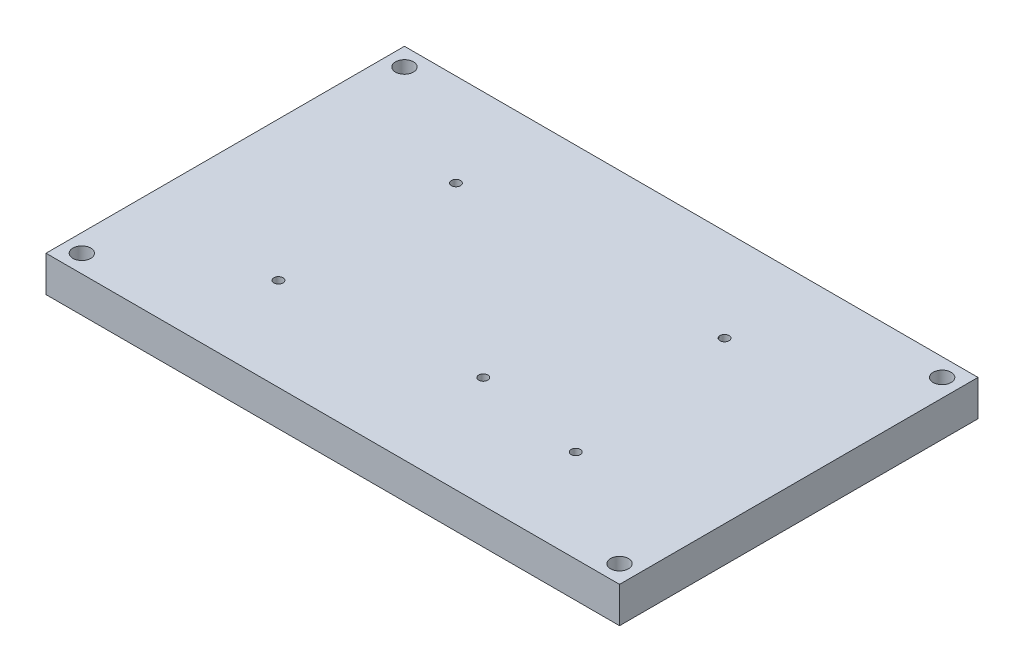
ISO-10303-21;
HEADER;
FILE_DESCRIPTION(('STEP AP214'),'2;1');
FILE_NAME('part.step','',(''),(''),'','','');
FILE_SCHEMA(('AUTOMOTIVE_DESIGN { 1 0 10303 214 1 1 1 1 }'));
ENDSEC;
DATA;
#1=APPLICATION_CONTEXT('core data for automotive mechanical design processes');
#2=APPLICATION_PROTOCOL_DEFINITION('international standard','automotive_design',2000,#1);
#3=PRODUCT_CONTEXT('',#1,'mechanical');
#4=PRODUCT('Part','Part','',(#3));
#5=PRODUCT_RELATED_PRODUCT_CATEGORY('part','',(#4));
#6=PRODUCT_DEFINITION_FORMATION('','',#4);
#7=PRODUCT_DEFINITION_CONTEXT('part definition',#1,'design');
#8=PRODUCT_DEFINITION('design','',#6,#7);
#9=PRODUCT_DEFINITION_SHAPE('','',#8);
#10=(LENGTH_UNIT() NAMED_UNIT(*) SI_UNIT(.MILLI.,.METRE.));
#11=(NAMED_UNIT(*) PLANE_ANGLE_UNIT() SI_UNIT($,.RADIAN.));
#12=(NAMED_UNIT(*) SI_UNIT($,.STERADIAN.) SOLID_ANGLE_UNIT());
#13=UNCERTAINTY_MEASURE_WITH_UNIT(LENGTH_MEASURE(1.E-05),#10,'distance_accuracy_value','');
#14=(GEOMETRIC_REPRESENTATION_CONTEXT(3) GLOBAL_UNCERTAINTY_ASSIGNED_CONTEXT((#13)) GLOBAL_UNIT_ASSIGNED_CONTEXT((#10,
#11,#12)) REPRESENTATION_CONTEXT('',''));
#15=CARTESIAN_POINT('',(0.,0.,0.));
#16=DIRECTION('',(0.,0.,1.));
#17=DIRECTION('',(1.,0.,0.));
#18=AXIS2_PLACEMENT_3D('',#15,#16,#17);
#19=CARTESIAN_POINT('',(0.,10.,0.));
#20=DIRECTION('',(0.,-1.,0.));
#21=DIRECTION('',(0.,0.,-1.));
#22=AXIS2_PLACEMENT_3D('',#19,#20,#21);
#23=PLANE('',#22);
#24=CARTESIAN_POINT('',(40.24,10.,-74.13));
#25=DIRECTION('',(0.,1.,0.));
#26=DIRECTION('',(0.,0.,1.));
#27=AXIS2_PLACEMENT_3D('',#24,#25,#26);
#28=CIRCLE('',#27,1.26999999999999);
#29=CARTESIAN_POINT('',(40.24,10.,-72.86));
#30=VERTEX_POINT('',#29);
#31=EDGE_CURVE('E147',#30,#30,#28,.T.);
#32=ORIENTED_EDGE('',*,*,#31,.F.);
#33=EDGE_LOOP('',(#32));
#34=FACE_BOUND('',#33,.T.);
#35=CARTESIAN_POINT('',(115.17,10.,-74.13));
#36=DIRECTION('',(0.,1.,0.));
#37=DIRECTION('',(0.,0.,1.));
#38=AXIS2_PLACEMENT_3D('',#35,#36,#37);
#39=CIRCLE('',#38,1.27000000000001);
#40=CARTESIAN_POINT('',(115.17,10.,-72.86));
#41=VERTEX_POINT('',#40);
#42=EDGE_CURVE('E153',#41,#41,#39,.T.);
#43=ORIENTED_EDGE('',*,*,#42,.F.);
#44=EDGE_LOOP('',(#43));
#45=FACE_BOUND('',#44,.T.);
#46=CARTESIAN_POINT('',(121.92,10.,-25.87));
#47=DIRECTION('',(0.,1.,0.));
#48=DIRECTION('',(0.,0.,1.));
#49=AXIS2_PLACEMENT_3D('',#46,#47,#48);
#50=CIRCLE('',#49,1.27);
#51=CARTESIAN_POINT('',(121.92,10.,-24.6));
#52=VERTEX_POINT('',#51);
#53=EDGE_CURVE('E159',#52,#52,#50,.T.);
#54=ORIENTED_EDGE('',*,*,#53,.F.);
#55=EDGE_LOOP('',(#54));
#56=FACE_BOUND('',#55,.T.);
#57=CARTESIAN_POINT('',(91.04,10.,-30.95));
#58=DIRECTION('',(0.,1.,0.));
#59=DIRECTION('',(0.,0.,1.));
#60=AXIS2_PLACEMENT_3D('',#57,#58,#59);
#61=CIRCLE('',#60,1.27000000000001);
#62=CARTESIAN_POINT('',(91.04,10.,-29.68));
#63=VERTEX_POINT('',#62);
#64=EDGE_CURVE('E141',#63,#63,#61,.T.);
#65=ORIENTED_EDGE('',*,*,#64,.F.);
#66=EDGE_LOOP('',(#65));
#67=FACE_BOUND('',#66,.T.);
#68=CARTESIAN_POINT('',(38.97,10.,-25.87));
#69=DIRECTION('',(0.,1.,0.));
#70=DIRECTION('',(0.,0.,1.));
#71=AXIS2_PLACEMENT_3D('',#68,#69,#70);
#72=CIRCLE('',#71,1.27);
#73=CARTESIAN_POINT('',(38.97,10.,-24.6));
#74=VERTEX_POINT('',#73);
#75=EDGE_CURVE('E138',#74,#74,#72,.T.);
#76=ORIENTED_EDGE('',*,*,#75,.F.);
#77=EDGE_LOOP('',(#76));
#78=FACE_BOUND('',#77,.T.);
#79=DIRECTION('',(0.,0.,1.));
#80=VECTOR('',#79,1.);
#81=CARTESIAN_POINT('',(0.,10.,0.));
#82=LINE('',#81,#80);
#83=CARTESIAN_POINT('',(0.,10.,-100.));
#84=VERTEX_POINT('',#83);
#85=CARTESIAN_POINT('',(0.,10.,0.));
#86=VERTEX_POINT('',#85);
#87=EDGE_CURVE('E87',#84,#86,#82,.T.);
#88=ORIENTED_EDGE('',*,*,#87,.T.);
#89=DIRECTION('',(1.,0.,0.));
#90=VECTOR('',#89,1.);
#91=CARTESIAN_POINT('',(0.,10.,0.));
#92=LINE('',#91,#90);
#93=CARTESIAN_POINT('',(160.,10.,0.));
#94=VERTEX_POINT('',#93);
#95=EDGE_CURVE('E82',#86,#94,#92,.T.);
#96=ORIENTED_EDGE('',*,*,#95,.T.);
#97=DIRECTION('',(0.,0.,-1.));
#98=VECTOR('',#97,1.);
#99=CARTESIAN_POINT('',(160.,10.,0.));
#100=LINE('',#99,#98);
#101=CARTESIAN_POINT('',(160.,10.,-100.));
#102=VERTEX_POINT('',#101);
#103=EDGE_CURVE('E85',#94,#102,#100,.T.);
#104=ORIENTED_EDGE('',*,*,#103,.T.);
#105=DIRECTION('',(-1.,0.,0.));
#106=VECTOR('',#105,1.);
#107=CARTESIAN_POINT('',(0.,10.,-100.));
#108=LINE('',#107,#106);
#109=EDGE_CURVE('E52',#102,#84,#108,.T.);
#110=ORIENTED_EDGE('',*,*,#109,.T.);
#111=EDGE_LOOP('',(#88,#96,#104,#110));
#112=FACE_BOUND('',#111,.T.);
#113=CARTESIAN_POINT('',(5.,10.,-95.));
#114=DIRECTION('',(0.,1.,0.));
#115=DIRECTION('',(0.,0.,1.));
#116=AXIS2_PLACEMENT_3D('',#113,#114,#115);
#117=CIRCLE('',#116,2.5);
#118=CARTESIAN_POINT('',(5.,10.,-92.5));
#119=VERTEX_POINT('',#118);
#120=EDGE_CURVE('E102',#119,#119,#117,.T.);
#121=ORIENTED_EDGE('',*,*,#120,.F.);
#122=EDGE_LOOP('',(#121));
#123=FACE_BOUND('',#122,.T.);
#124=CARTESIAN_POINT('',(5.,10.,-5.));
#125=DIRECTION('',(0.,1.,0.));
#126=DIRECTION('',(0.,0.,1.));
#127=AXIS2_PLACEMENT_3D('',#124,#125,#126);
#128=CIRCLE('',#127,2.5);
#129=CARTESIAN_POINT('',(5.,10.,-2.5));
#130=VERTEX_POINT('',#129);
#131=EDGE_CURVE('E117',#130,#130,#128,.T.);
#132=ORIENTED_EDGE('',*,*,#131,.F.);
#133=EDGE_LOOP('',(#132));
#134=FACE_BOUND('',#133,.T.);
#135=CARTESIAN_POINT('',(155.,10.,-95.));
#136=DIRECTION('',(0.,1.,0.));
#137=DIRECTION('',(0.,0.,1.));
#138=AXIS2_PLACEMENT_3D('',#135,#136,#137);
#139=CIRCLE('',#138,2.5);
#140=CARTESIAN_POINT('',(155.,10.,-92.5));
#141=VERTEX_POINT('',#140);
#142=EDGE_CURVE('E123',#141,#141,#139,.T.);
#143=ORIENTED_EDGE('',*,*,#142,.F.);
#144=EDGE_LOOP('',(#143));
#145=FACE_BOUND('',#144,.T.);
#146=CARTESIAN_POINT('',(155.,10.,-5.));
#147=DIRECTION('',(0.,1.,0.));
#148=DIRECTION('',(0.,0.,1.));
#149=AXIS2_PLACEMENT_3D('',#146,#147,#148);
#150=CIRCLE('',#149,2.5);
#151=CARTESIAN_POINT('',(155.,10.,-2.5));
#152=VERTEX_POINT('',#151);
#153=EDGE_CURVE('E129',#152,#152,#150,.T.);
#154=ORIENTED_EDGE('',*,*,#153,.F.);
#155=EDGE_LOOP('',(#154));
#156=FACE_BOUND('',#155,.T.);
#157=ADVANCED_FACE('F35',(#34,#45,#56,#67,#78,#112,#123,#134,#145,#156),#23,.F.);
#158=CARTESIAN_POINT('',(0.,0.,0.));
#159=DIRECTION('',(0.,-1.,0.));
#160=DIRECTION('',(0.,0.,-1.));
#161=AXIS2_PLACEMENT_3D('',#158,#159,#160);
#162=PLANE('',#161);
#163=CARTESIAN_POINT('',(40.24,0.,-74.13));
#164=DIRECTION('',(0.,1.,0.));
#165=DIRECTION('',(0.,0.,1.));
#166=AXIS2_PLACEMENT_3D('',#163,#164,#165);
#167=CIRCLE('',#166,1.26999999999999);
#168=CARTESIAN_POINT('',(40.24,0.,-72.86));
#169=VERTEX_POINT('',#168);
#170=EDGE_CURVE('E144',#169,#169,#167,.T.);
#171=ORIENTED_EDGE('',*,*,#170,.T.);
#172=EDGE_LOOP('',(#171));
#173=FACE_BOUND('',#172,.T.);
#174=CARTESIAN_POINT('',(115.17,0.,-74.13));
#175=DIRECTION('',(0.,1.,0.));
#176=DIRECTION('',(0.,0.,1.));
#177=AXIS2_PLACEMENT_3D('',#174,#175,#176);
#178=CIRCLE('',#177,1.27000000000001);
#179=CARTESIAN_POINT('',(115.17,0.,-72.86));
#180=VERTEX_POINT('',#179);
#181=EDGE_CURVE('E150',#180,#180,#178,.T.);
#182=ORIENTED_EDGE('',*,*,#181,.T.);
#183=EDGE_LOOP('',(#182));
#184=FACE_BOUND('',#183,.T.);
#185=CARTESIAN_POINT('',(121.92,0.,-25.87));
#186=DIRECTION('',(0.,1.,0.));
#187=DIRECTION('',(0.,0.,1.));
#188=AXIS2_PLACEMENT_3D('',#185,#186,#187);
#189=CIRCLE('',#188,1.27);
#190=CARTESIAN_POINT('',(121.92,0.,-24.6));
#191=VERTEX_POINT('',#190);
#192=EDGE_CURVE('E156',#191,#191,#189,.T.);
#193=ORIENTED_EDGE('',*,*,#192,.T.);
#194=EDGE_LOOP('',(#193));
#195=FACE_BOUND('',#194,.T.);
#196=CARTESIAN_POINT('',(91.04,0.,-30.95));
#197=DIRECTION('',(0.,1.,0.));
#198=DIRECTION('',(0.,0.,1.));
#199=AXIS2_PLACEMENT_3D('',#196,#197,#198);
#200=CIRCLE('',#199,1.27000000000001);
#201=CARTESIAN_POINT('',(91.04,0.,-29.68));
#202=VERTEX_POINT('',#201);
#203=EDGE_CURVE('E162',#202,#202,#200,.T.);
#204=ORIENTED_EDGE('',*,*,#203,.T.);
#205=EDGE_LOOP('',(#204));
#206=FACE_BOUND('',#205,.T.);
#207=CARTESIAN_POINT('',(38.97,0.,-25.87));
#208=DIRECTION('',(0.,1.,0.));
#209=DIRECTION('',(0.,0.,1.));
#210=AXIS2_PLACEMENT_3D('',#207,#208,#209);
#211=CIRCLE('',#210,1.27);
#212=CARTESIAN_POINT('',(38.97,0.,-24.6));
#213=VERTEX_POINT('',#212);
#214=EDGE_CURVE('E135',#213,#213,#211,.T.);
#215=ORIENTED_EDGE('',*,*,#214,.T.);
#216=EDGE_LOOP('',(#215));
#217=FACE_BOUND('',#216,.T.);
#218=CARTESIAN_POINT('',(155.,0.,-95.));
#219=DIRECTION('',(0.,1.,0.));
#220=DIRECTION('',(0.,0.,1.));
#221=AXIS2_PLACEMENT_3D('',#218,#219,#220);
#222=CIRCLE('',#221,2.5);
#223=CARTESIAN_POINT('',(155.,0.,-92.5));
#224=VERTEX_POINT('',#223);
#225=EDGE_CURVE('E126',#224,#224,#222,.T.);
#226=ORIENTED_EDGE('',*,*,#225,.T.);
#227=EDGE_LOOP('',(#226));
#228=FACE_BOUND('',#227,.T.);
#229=CARTESIAN_POINT('',(5.,0.,-95.));
#230=DIRECTION('',(0.,1.,0.));
#231=DIRECTION('',(0.,0.,1.));
#232=AXIS2_PLACEMENT_3D('',#229,#230,#231);
#233=CIRCLE('',#232,2.5);
#234=CARTESIAN_POINT('',(5.,0.,-92.5));
#235=VERTEX_POINT('',#234);
#236=EDGE_CURVE('E114',#235,#235,#233,.T.);
#237=ORIENTED_EDGE('',*,*,#236,.T.);
#238=EDGE_LOOP('',(#237));
#239=FACE_BOUND('',#238,.T.);
#240=DIRECTION('',(0.,0.,1.));
#241=VECTOR('',#240,1.);
#242=CARTESIAN_POINT('',(0.,0.,0.));
#243=LINE('',#242,#241);
#244=CARTESIAN_POINT('',(0.,0.,-100.));
#245=VERTEX_POINT('',#244);
#246=CARTESIAN_POINT('',(0.,0.,0.));
#247=VERTEX_POINT('',#246);
#248=EDGE_CURVE('E99',#245,#247,#243,.T.);
#249=ORIENTED_EDGE('',*,*,#248,.F.);
#250=DIRECTION('',(-1.,0.,0.));
#251=VECTOR('',#250,1.);
#252=CARTESIAN_POINT('',(0.,0.,-100.));
#253=LINE('',#252,#251);
#254=CARTESIAN_POINT('',(160.,0.,-100.));
#255=VERTEX_POINT('',#254);
#256=EDGE_CURVE('E75',#255,#245,#253,.T.);
#257=ORIENTED_EDGE('',*,*,#256,.F.);
#258=DIRECTION('',(0.,0.,-1.));
#259=VECTOR('',#258,1.);
#260=CARTESIAN_POINT('',(160.,0.,0.));
#261=LINE('',#260,#259);
#262=CARTESIAN_POINT('',(160.,0.,0.));
#263=VERTEX_POINT('',#262);
#264=EDGE_CURVE('E69',#263,#255,#261,.T.);
#265=ORIENTED_EDGE('',*,*,#264,.F.);
#266=DIRECTION('',(1.,0.,0.));
#267=VECTOR('',#266,1.);
#268=CARTESIAN_POINT('',(0.,0.,0.));
#269=LINE('',#268,#267);
#270=EDGE_CURVE('E91',#247,#263,#269,.T.);
#271=ORIENTED_EDGE('',*,*,#270,.F.);
#272=EDGE_LOOP('',(#249,#257,#265,#271));
#273=FACE_BOUND('',#272,.T.);
#274=CARTESIAN_POINT('',(5.,0.,-5.));
#275=DIRECTION('',(0.,1.,0.));
#276=DIRECTION('',(0.,0.,1.));
#277=AXIS2_PLACEMENT_3D('',#274,#275,#276);
#278=CIRCLE('',#277,2.5);
#279=CARTESIAN_POINT('',(5.,0.,-2.5));
#280=VERTEX_POINT('',#279);
#281=EDGE_CURVE('E120',#280,#280,#278,.T.);
#282=ORIENTED_EDGE('',*,*,#281,.T.);
#283=EDGE_LOOP('',(#282));
#284=FACE_BOUND('',#283,.T.);
#285=CARTESIAN_POINT('',(155.,0.,-5.));
#286=DIRECTION('',(0.,1.,0.));
#287=DIRECTION('',(0.,0.,1.));
#288=AXIS2_PLACEMENT_3D('',#285,#286,#287);
#289=CIRCLE('',#288,2.5);
#290=CARTESIAN_POINT('',(155.,0.,-2.5));
#291=VERTEX_POINT('',#290);
#292=EDGE_CURVE('E132',#291,#291,#289,.T.);
#293=ORIENTED_EDGE('',*,*,#292,.T.);
#294=EDGE_LOOP('',(#293));
#295=FACE_BOUND('',#294,.T.);
#296=ADVANCED_FACE('F110',(#173,#184,#195,#206,#217,#228,#239,#273,#284,#295),#162,.T.);
#297=CARTESIAN_POINT('',(0.,10.,0.));
#298=DIRECTION('',(1.,0.,0.));
#299=DIRECTION('',(0.,0.,-1.));
#300=AXIS2_PLACEMENT_3D('',#297,#298,#299);
#301=PLANE('',#300);
#302=ORIENTED_EDGE('',*,*,#248,.T.);
#303=DIRECTION('',(0.,-1.,0.));
#304=VECTOR('',#303,1.);
#305=CARTESIAN_POINT('',(0.,10.,0.));
#306=LINE('',#305,#304);
#307=EDGE_CURVE('E11',#86,#247,#306,.T.);
#308=ORIENTED_EDGE('',*,*,#307,.F.);
#309=ORIENTED_EDGE('',*,*,#87,.F.);
#310=DIRECTION('',(0.,-1.,0.));
#311=VECTOR('',#310,1.);
#312=CARTESIAN_POINT('',(0.,10.,-100.));
#313=LINE('',#312,#311);
#314=EDGE_CURVE('E95',#84,#245,#313,.T.);
#315=ORIENTED_EDGE('',*,*,#314,.T.);
#316=EDGE_LOOP('',(#302,#308,#309,#315));
#317=FACE_BOUND('',#316,.T.);
#318=ADVANCED_FACE('F37',(#317),#301,.F.);
#319=CARTESIAN_POINT('',(0.,10.,0.));
#320=DIRECTION('',(0.,0.,-1.));
#321=DIRECTION('',(-1.,0.,0.));
#322=AXIS2_PLACEMENT_3D('',#319,#320,#321);
#323=PLANE('',#322);
#324=ORIENTED_EDGE('',*,*,#270,.T.);
#325=DIRECTION('',(0.,-1.,0.));
#326=VECTOR('',#325,1.);
#327=CARTESIAN_POINT('',(160.,10.,0.));
#328=LINE('',#327,#326);
#329=EDGE_CURVE('E44',#94,#263,#328,.T.);
#330=ORIENTED_EDGE('',*,*,#329,.F.);
#331=ORIENTED_EDGE('',*,*,#95,.F.);
#332=ORIENTED_EDGE('',*,*,#307,.T.);
#333=EDGE_LOOP('',(#324,#330,#331,#332));
#334=FACE_BOUND('',#333,.T.);
#335=ADVANCED_FACE('F90',(#334),#323,.F.);
#336=CARTESIAN_POINT('',(160.,10.,0.));
#337=DIRECTION('',(-1.,0.,0.));
#338=DIRECTION('',(0.,0.,1.));
#339=AXIS2_PLACEMENT_3D('',#336,#337,#338);
#340=PLANE('',#339);
#341=ORIENTED_EDGE('',*,*,#264,.T.);
#342=DIRECTION('',(0.,-1.,0.));
#343=VECTOR('',#342,1.);
#344=CARTESIAN_POINT('',(160.,10.,-100.));
#345=LINE('',#344,#343);
#346=EDGE_CURVE('E92',#102,#255,#345,.T.);
#347=ORIENTED_EDGE('',*,*,#346,.F.);
#348=ORIENTED_EDGE('',*,*,#103,.F.);
#349=ORIENTED_EDGE('',*,*,#329,.T.);
#350=EDGE_LOOP('',(#341,#347,#348,#349));
#351=FACE_BOUND('',#350,.T.);
#352=ADVANCED_FACE('F93',(#351),#340,.F.);
#353=CARTESIAN_POINT('',(0.,10.,-100.));
#354=DIRECTION('',(0.,0.,1.));
#355=DIRECTION('',(1.,0.,0.));
#356=AXIS2_PLACEMENT_3D('',#353,#354,#355);
#357=PLANE('',#356);
#358=ORIENTED_EDGE('',*,*,#256,.T.);
#359=ORIENTED_EDGE('',*,*,#314,.F.);
#360=ORIENTED_EDGE('',*,*,#109,.F.);
#361=ORIENTED_EDGE('',*,*,#346,.T.);
#362=EDGE_LOOP('',(#358,#359,#360,#361));
#363=FACE_BOUND('',#362,.T.);
#364=ADVANCED_FACE('F107',(#363),#357,.F.);
#365=CARTESIAN_POINT('',(5.,10.,-95.));
#366=DIRECTION('',(0.,-1.,0.));
#367=DIRECTION('',(0.,0.,-1.));
#368=AXIS2_PLACEMENT_3D('',#365,#366,#367);
#369=CYLINDRICAL_SURFACE('',#368,2.5);
#370=ORIENTED_EDGE('',*,*,#120,.T.);
#371=EDGE_LOOP('',(#370));
#372=FACE_BOUND('',#371,.T.);
#373=ORIENTED_EDGE('',*,*,#236,.F.);
#374=EDGE_LOOP('',(#373));
#375=FACE_BOUND('',#374,.T.);
#376=ADVANCED_FACE('F202',(#372,#375),#369,.F.);
#377=CARTESIAN_POINT('',(5.,10.,-5.));
#378=DIRECTION('',(0.,-1.,0.));
#379=DIRECTION('',(0.,0.,-1.));
#380=AXIS2_PLACEMENT_3D('',#377,#378,#379);
#381=CYLINDRICAL_SURFACE('',#380,2.5);
#382=ORIENTED_EDGE('',*,*,#131,.T.);
#383=EDGE_LOOP('',(#382));
#384=FACE_BOUND('',#383,.T.);
#385=ORIENTED_EDGE('',*,*,#281,.F.);
#386=EDGE_LOOP('',(#385));
#387=FACE_BOUND('',#386,.T.);
#388=ADVANCED_FACE('F198',(#384,#387),#381,.F.);
#389=CARTESIAN_POINT('',(155.,10.,-95.));
#390=DIRECTION('',(0.,-1.,0.));
#391=DIRECTION('',(0.,0.,-1.));
#392=AXIS2_PLACEMENT_3D('',#389,#390,#391);
#393=CYLINDRICAL_SURFACE('',#392,2.5);
#394=ORIENTED_EDGE('',*,*,#142,.T.);
#395=EDGE_LOOP('',(#394));
#396=FACE_BOUND('',#395,.T.);
#397=ORIENTED_EDGE('',*,*,#225,.F.);
#398=EDGE_LOOP('',(#397));
#399=FACE_BOUND('',#398,.T.);
#400=ADVANCED_FACE('F188',(#396,#399),#393,.F.);
#401=CARTESIAN_POINT('',(155.,10.,-5.));
#402=DIRECTION('',(0.,-1.,0.));
#403=DIRECTION('',(0.,0.,-1.));
#404=AXIS2_PLACEMENT_3D('',#401,#402,#403);
#405=CYLINDRICAL_SURFACE('',#404,2.5);
#406=ORIENTED_EDGE('',*,*,#153,.T.);
#407=EDGE_LOOP('',(#406));
#408=FACE_BOUND('',#407,.T.);
#409=ORIENTED_EDGE('',*,*,#292,.F.);
#410=EDGE_LOOP('',(#409));
#411=FACE_BOUND('',#410,.T.);
#412=ADVANCED_FACE('F178',(#408,#411),#405,.F.);
#413=CARTESIAN_POINT('',(38.97,0.,-25.87));
#414=DIRECTION('',(0.,1.,0.));
#415=DIRECTION('',(0.,0.,1.));
#416=AXIS2_PLACEMENT_3D('',#413,#414,#415);
#417=CYLINDRICAL_SURFACE('',#416,1.27);
#418=ORIENTED_EDGE('',*,*,#214,.F.);
#419=EDGE_LOOP('',(#418));
#420=FACE_BOUND('',#419,.T.);
#421=ORIENTED_EDGE('',*,*,#75,.T.);
#422=EDGE_LOOP('',(#421));
#423=FACE_BOUND('',#422,.T.);
#424=ADVANCED_FACE('F176',(#420,#423),#417,.F.);
#425=CARTESIAN_POINT('',(91.04,0.,-30.95));
#426=DIRECTION('',(0.,1.,0.));
#427=DIRECTION('',(0.,0.,1.));
#428=AXIS2_PLACEMENT_3D('',#425,#426,#427);
#429=CYLINDRICAL_SURFACE('',#428,1.27000000000001);
#430=ORIENTED_EDGE('',*,*,#203,.F.);
#431=EDGE_LOOP('',(#430));
#432=FACE_BOUND('',#431,.T.);
#433=ORIENTED_EDGE('',*,*,#64,.T.);
#434=EDGE_LOOP('',(#433));
#435=FACE_BOUND('',#434,.T.);
#436=ADVANCED_FACE('F168',(#432,#435),#429,.F.);
#437=CARTESIAN_POINT('',(121.92,0.,-25.87));
#438=DIRECTION('',(0.,1.,0.));
#439=DIRECTION('',(0.,0.,1.));
#440=AXIS2_PLACEMENT_3D('',#437,#438,#439);
#441=CYLINDRICAL_SURFACE('',#440,1.27);
#442=ORIENTED_EDGE('',*,*,#192,.F.);
#443=EDGE_LOOP('',(#442));
#444=FACE_BOUND('',#443,.T.);
#445=ORIENTED_EDGE('',*,*,#53,.T.);
#446=EDGE_LOOP('',(#445));
#447=FACE_BOUND('',#446,.T.);
#448=ADVANCED_FACE('F185',(#444,#447),#441,.F.);
#449=CARTESIAN_POINT('',(115.17,0.,-74.13));
#450=DIRECTION('',(0.,1.,0.));
#451=DIRECTION('',(0.,0.,1.));
#452=AXIS2_PLACEMENT_3D('',#449,#450,#451);
#453=CYLINDRICAL_SURFACE('',#452,1.27000000000001);
#454=ORIENTED_EDGE('',*,*,#181,.F.);
#455=EDGE_LOOP('',(#454));
#456=FACE_BOUND('',#455,.T.);
#457=ORIENTED_EDGE('',*,*,#42,.T.);
#458=EDGE_LOOP('',(#457));
#459=FACE_BOUND('',#458,.T.);
#460=ADVANCED_FACE('F290',(#456,#459),#453,.F.);
#461=CARTESIAN_POINT('',(40.24,0.,-74.13));
#462=DIRECTION('',(0.,1.,0.));
#463=DIRECTION('',(0.,0.,1.));
#464=AXIS2_PLACEMENT_3D('',#461,#462,#463);
#465=CYLINDRICAL_SURFACE('',#464,1.26999999999999);
#466=ORIENTED_EDGE('',*,*,#170,.F.);
#467=EDGE_LOOP('',(#466));
#468=FACE_BOUND('',#467,.T.);
#469=ORIENTED_EDGE('',*,*,#31,.T.);
#470=EDGE_LOOP('',(#469));
#471=FACE_BOUND('',#470,.T.);
#472=ADVANCED_FACE('F193',(#468,#471),#465,.F.);
#473=CLOSED_SHELL('',(#157,#296,#318,#335,#352,#364,#376,#388,#400,#412,#424,#436,#448,#460,#472));
#474=MANIFOLD_SOLID_BREP('B2',#473);
#475=ADVANCED_BREP_SHAPE_REPRESENTATION('',(#18,#474),#14);
#476=SHAPE_DEFINITION_REPRESENTATION(#9,#475);
ENDSEC;
END-ISO-10303-21;
